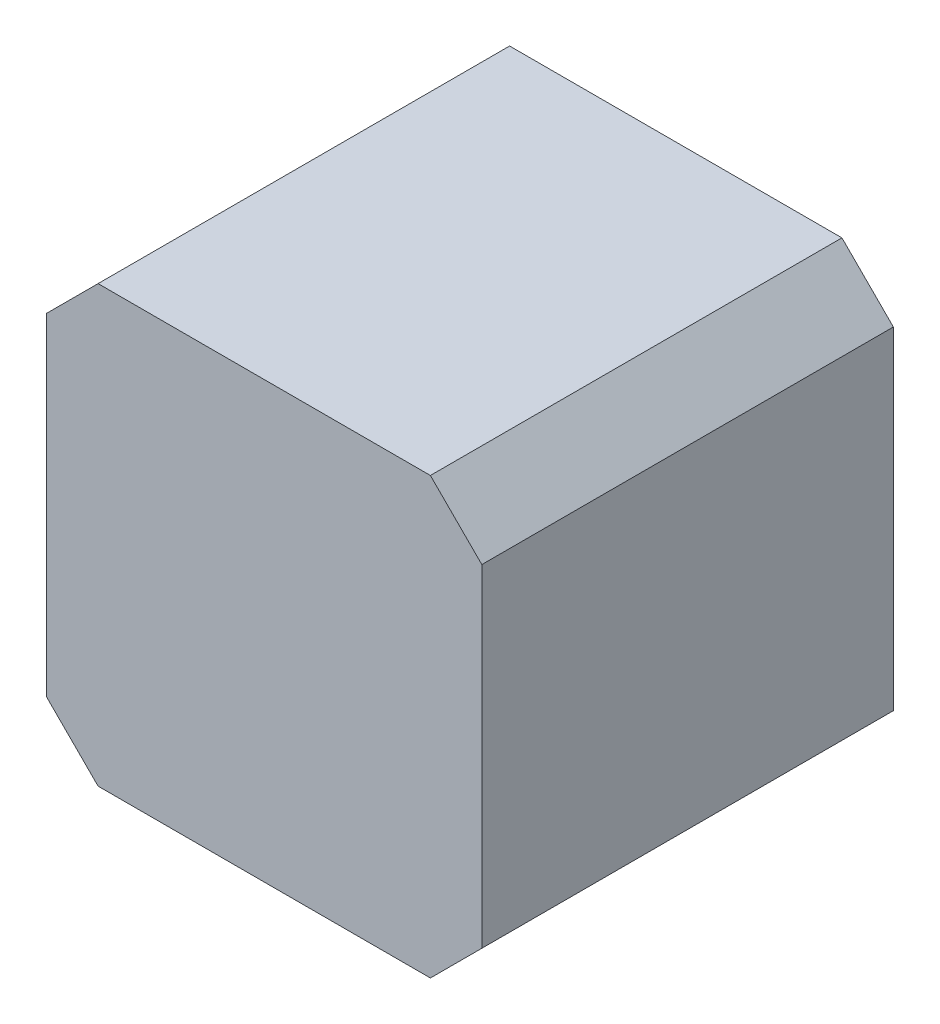
ISO-10303-21;
HEADER;
FILE_DESCRIPTION(('STEP AP214'),'2;1');
FILE_NAME('part.step','',(''),(''),'','','');
FILE_SCHEMA(('AUTOMOTIVE_DESIGN { 1 0 10303 214 1 1 1 1 }'));
ENDSEC;
DATA;
#1=APPLICATION_CONTEXT('core data for automotive mechanical design processes');
#2=APPLICATION_PROTOCOL_DEFINITION('international standard','automotive_design',2000,#1);
#3=PRODUCT_CONTEXT('',#1,'mechanical');
#4=PRODUCT('Part','Part','',(#3));
#5=PRODUCT_RELATED_PRODUCT_CATEGORY('part','',(#4));
#6=PRODUCT_DEFINITION_FORMATION('','',#4);
#7=PRODUCT_DEFINITION_CONTEXT('part definition',#1,'design');
#8=PRODUCT_DEFINITION('design','',#6,#7);
#9=PRODUCT_DEFINITION_SHAPE('','',#8);
#10=(LENGTH_UNIT() NAMED_UNIT(*) SI_UNIT(.MILLI.,.METRE.));
#11=(NAMED_UNIT(*) PLANE_ANGLE_UNIT() SI_UNIT($,.RADIAN.));
#12=(NAMED_UNIT(*) SI_UNIT($,.STERADIAN.) SOLID_ANGLE_UNIT());
#13=UNCERTAINTY_MEASURE_WITH_UNIT(LENGTH_MEASURE(1.E-05),#10,'distance_accuracy_value','');
#14=(GEOMETRIC_REPRESENTATION_CONTEXT(3) GLOBAL_UNCERTAINTY_ASSIGNED_CONTEXT((#13)) GLOBAL_UNIT_ASSIGNED_CONTEXT((#10,
#11,#12)) REPRESENTATION_CONTEXT('',''));
#15=CARTESIAN_POINT('',(0.,0.,0.));
#16=DIRECTION('',(0.,0.,1.));
#17=DIRECTION('',(1.,0.,0.));
#18=AXIS2_PLACEMENT_3D('',#15,#16,#17);
#19=CARTESIAN_POINT('',(-21.15,21.15,40.));
#20=DIRECTION('',(1.,0.,0.));
#21=DIRECTION('',(0.,1.,0.));
#22=AXIS2_PLACEMENT_3D('',#19,#20,#21);
#23=PLANE('',#22);
#24=DIRECTION('',(0.,-1.,0.));
#25=VECTOR('',#24,1.);
#26=CARTESIAN_POINT('',(-21.15,21.15,0.));
#27=LINE('',#26,#25);
#28=CARTESIAN_POINT('',(-21.15,16.15,0.));
#29=VERTEX_POINT('',#28);
#30=CARTESIAN_POINT('',(-21.15,-16.15,0.));
#31=VERTEX_POINT('',#30);
#32=EDGE_CURVE('E125',#29,#31,#27,.T.);
#33=ORIENTED_EDGE('',*,*,#32,.T.);
#34=DIRECTION('',(0.,0.,1.));
#35=VECTOR('',#34,1.);
#36=CARTESIAN_POINT('',(-21.15,-16.15,40.));
#37=LINE('',#36,#35);
#38=CARTESIAN_POINT('',(-21.15,-16.15,40.));
#39=VERTEX_POINT('',#38);
#40=EDGE_CURVE('E103',#31,#39,#37,.T.);
#41=ORIENTED_EDGE('',*,*,#40,.T.);
#42=DIRECTION('',(0.,-1.,0.));
#43=VECTOR('',#42,1.);
#44=CARTESIAN_POINT('',(-21.15,21.15,40.));
#45=LINE('',#44,#43);
#46=CARTESIAN_POINT('',(-21.15,16.15,40.));
#47=VERTEX_POINT('',#46);
#48=EDGE_CURVE('E134',#47,#39,#45,.T.);
#49=ORIENTED_EDGE('',*,*,#48,.F.);
#50=DIRECTION('',(0.,0.,-1.));
#51=VECTOR('',#50,1.);
#52=CARTESIAN_POINT('',(-21.15,16.15,40.));
#53=LINE('',#52,#51);
#54=EDGE_CURVE('E108',#47,#29,#53,.T.);
#55=ORIENTED_EDGE('',*,*,#54,.T.);
#56=EDGE_LOOP('',(#33,#41,#49,#55));
#57=FACE_BOUND('',#56,.T.);
#58=ADVANCED_FACE('F32',(#57),#23,.F.);
#59=CARTESIAN_POINT('',(21.15,-21.15,40.));
#60=DIRECTION('',(0.,1.,0.));
#61=DIRECTION('',(-1.,0.,0.));
#62=AXIS2_PLACEMENT_3D('',#59,#60,#61);
#63=PLANE('',#62);
#64=DIRECTION('',(1.,0.,0.));
#65=VECTOR('',#64,1.);
#66=CARTESIAN_POINT('',(21.15,-21.15,40.));
#67=LINE('',#66,#65);
#68=CARTESIAN_POINT('',(-16.15,-21.15,40.));
#69=VERTEX_POINT('',#68);
#70=CARTESIAN_POINT('',(16.15,-21.15,40.));
#71=VERTEX_POINT('',#70);
#72=EDGE_CURVE('E118',#69,#71,#67,.T.);
#73=ORIENTED_EDGE('',*,*,#72,.F.);
#74=DIRECTION('',(0.,0.,-1.));
#75=VECTOR('',#74,1.);
#76=CARTESIAN_POINT('',(-16.15,-21.15,40.));
#77=LINE('',#76,#75);
#78=CARTESIAN_POINT('',(-16.15,-21.15,0.));
#79=VERTEX_POINT('',#78);
#80=EDGE_CURVE('E102',#69,#79,#77,.T.);
#81=ORIENTED_EDGE('',*,*,#80,.T.);
#82=DIRECTION('',(1.,0.,0.));
#83=VECTOR('',#82,1.);
#84=CARTESIAN_POINT('',(21.15,-21.15,0.));
#85=LINE('',#84,#83);
#86=CARTESIAN_POINT('',(16.15,-21.15,0.));
#87=VERTEX_POINT('',#86);
#88=EDGE_CURVE('E115',#79,#87,#85,.T.);
#89=ORIENTED_EDGE('',*,*,#88,.T.);
#90=DIRECTION('',(0.,0.,1.));
#91=VECTOR('',#90,1.);
#92=CARTESIAN_POINT('',(16.15,-21.15,40.));
#93=LINE('',#92,#91);
#94=EDGE_CURVE('E120',#87,#71,#93,.T.);
#95=ORIENTED_EDGE('',*,*,#94,.T.);
#96=EDGE_LOOP('',(#73,#81,#89,#95));
#97=FACE_BOUND('',#96,.T.);
#98=ADVANCED_FACE('F114',(#97),#63,.F.);
#99=CARTESIAN_POINT('',(21.15,21.15,40.));
#100=DIRECTION('',(-1.,0.,0.));
#101=DIRECTION('',(0.,-1.,0.));
#102=AXIS2_PLACEMENT_3D('',#99,#100,#101);
#103=PLANE('',#102);
#104=DIRECTION('',(0.,1.,0.));
#105=VECTOR('',#104,1.);
#106=CARTESIAN_POINT('',(21.15,21.15,40.));
#107=LINE('',#106,#105);
#108=CARTESIAN_POINT('',(21.15,-16.15,40.));
#109=VERTEX_POINT('',#108);
#110=CARTESIAN_POINT('',(21.15,16.15,40.));
#111=VERTEX_POINT('',#110);
#112=EDGE_CURVE('E160',#109,#111,#107,.T.);
#113=ORIENTED_EDGE('',*,*,#112,.F.);
#114=DIRECTION('',(0.,0.,-1.));
#115=VECTOR('',#114,1.);
#116=CARTESIAN_POINT('',(21.15,-16.15,40.));
#117=LINE('',#116,#115);
#118=CARTESIAN_POINT('',(21.15,-16.15,0.));
#119=VERTEX_POINT('',#118);
#120=EDGE_CURVE('E153',#109,#119,#117,.T.);
#121=ORIENTED_EDGE('',*,*,#120,.T.);
#122=DIRECTION('',(0.,1.,0.));
#123=VECTOR('',#122,1.);
#124=CARTESIAN_POINT('',(21.15,21.15,0.));
#125=LINE('',#124,#123);
#126=CARTESIAN_POINT('',(21.15,16.15,0.));
#127=VERTEX_POINT('',#126);
#128=EDGE_CURVE('E124',#119,#127,#125,.T.);
#129=ORIENTED_EDGE('',*,*,#128,.T.);
#130=DIRECTION('',(0.,0.,1.));
#131=VECTOR('',#130,1.);
#132=CARTESIAN_POINT('',(21.15,16.15,40.));
#133=LINE('',#132,#131);
#134=EDGE_CURVE('E151',#127,#111,#133,.T.);
#135=ORIENTED_EDGE('',*,*,#134,.T.);
#136=EDGE_LOOP('',(#113,#121,#129,#135));
#137=FACE_BOUND('',#136,.T.);
#138=ADVANCED_FACE('F158',(#137),#103,.F.);
#139=CARTESIAN_POINT('',(21.15,21.15,40.));
#140=DIRECTION('',(0.,-1.,0.));
#141=DIRECTION('',(1.,0.,0.));
#142=AXIS2_PLACEMENT_3D('',#139,#140,#141);
#143=PLANE('',#142);
#144=DIRECTION('',(-1.,0.,0.));
#145=VECTOR('',#144,1.);
#146=CARTESIAN_POINT('',(21.15,21.15,40.));
#147=LINE('',#146,#145);
#148=CARTESIAN_POINT('',(16.15,21.15,40.));
#149=VERTEX_POINT('',#148);
#150=CARTESIAN_POINT('',(-16.15,21.15,40.));
#151=VERTEX_POINT('',#150);
#152=EDGE_CURVE('E135',#149,#151,#147,.T.);
#153=ORIENTED_EDGE('',*,*,#152,.F.);
#154=DIRECTION('',(0.,0.,-1.));
#155=VECTOR('',#154,1.);
#156=CARTESIAN_POINT('',(16.15,21.15,40.));
#157=LINE('',#156,#155);
#158=CARTESIAN_POINT('',(16.15,21.15,0.));
#159=VERTEX_POINT('',#158);
#160=EDGE_CURVE('E11',#149,#159,#157,.T.);
#161=ORIENTED_EDGE('',*,*,#160,.T.);
#162=DIRECTION('',(-1.,0.,0.));
#163=VECTOR('',#162,1.);
#164=CARTESIAN_POINT('',(21.15,21.15,0.));
#165=LINE('',#164,#163);
#166=CARTESIAN_POINT('',(-16.15,21.15,0.));
#167=VERTEX_POINT('',#166);
#168=EDGE_CURVE('E128',#159,#167,#165,.T.);
#169=ORIENTED_EDGE('',*,*,#168,.T.);
#170=DIRECTION('',(0.,0.,1.));
#171=VECTOR('',#170,1.);
#172=CARTESIAN_POINT('',(-16.15,21.15,40.));
#173=LINE('',#172,#171);
#174=EDGE_CURVE('E40',#167,#151,#173,.T.);
#175=ORIENTED_EDGE('',*,*,#174,.T.);
#176=EDGE_LOOP('',(#153,#161,#169,#175));
#177=FACE_BOUND('',#176,.T.);
#178=ADVANCED_FACE('F167',(#177),#143,.F.);
#179=CARTESIAN_POINT('',(0.,0.,40.));
#180=DIRECTION('',(0.,0.,-1.));
#181=DIRECTION('',(-1.,0.,0.));
#182=AXIS2_PLACEMENT_3D('',#179,#180,#181);
#183=PLANE('',#182);
#184=ORIENTED_EDGE('',*,*,#48,.T.);
#185=DIRECTION('',(-0.707106781186546,0.707106781186549,0.));
#186=VECTOR('',#185,1.);
#187=CARTESIAN_POINT('',(-16.15,-21.15,40.));
#188=LINE('',#187,#186);
#189=EDGE_CURVE('E149',#39,#69,#188,.F.);
#190=ORIENTED_EDGE('',*,*,#189,.T.);
#191=ORIENTED_EDGE('',*,*,#72,.T.);
#192=DIRECTION('',(-0.707106781186549,-0.707106781186547,0.));
#193=VECTOR('',#192,1.);
#194=CARTESIAN_POINT('',(21.15,-16.15,40.));
#195=LINE('',#194,#193);
#196=EDGE_CURVE('E147',#71,#109,#195,.F.);
#197=ORIENTED_EDGE('',*,*,#196,.T.);
#198=ORIENTED_EDGE('',*,*,#112,.T.);
#199=DIRECTION('',(0.707106781186547,-0.707106781186549,0.));
#200=VECTOR('',#199,1.);
#201=CARTESIAN_POINT('',(16.15,21.15,40.));
#202=LINE('',#201,#200);
#203=EDGE_CURVE('E53',#111,#149,#202,.F.);
#204=ORIENTED_EDGE('',*,*,#203,.T.);
#205=ORIENTED_EDGE('',*,*,#152,.T.);
#206=DIRECTION('',(0.707106781186549,0.707106781186546,0.));
#207=VECTOR('',#206,1.);
#208=CARTESIAN_POINT('',(-21.15,16.15,40.));
#209=LINE('',#208,#207);
#210=EDGE_CURVE('E144',#151,#47,#209,.F.);
#211=ORIENTED_EDGE('',*,*,#210,.T.);
#212=EDGE_LOOP('',(#184,#190,#191,#197,#198,#204,#205,#211));
#213=FACE_BOUND('',#212,.T.);
#214=ADVANCED_FACE('F174',(#213),#183,.F.);
#215=CARTESIAN_POINT('',(0.,0.,0.));
#216=DIRECTION('',(0.,0.,-1.));
#217=DIRECTION('',(-1.,0.,0.));
#218=AXIS2_PLACEMENT_3D('',#215,#216,#217);
#219=PLANE('',#218);
#220=ORIENTED_EDGE('',*,*,#88,.F.);
#221=DIRECTION('',(0.707106781186546,-0.707106781186549,0.));
#222=VECTOR('',#221,1.);
#223=CARTESIAN_POINT('',(-18.65,-18.65,0.));
#224=LINE('',#223,#222);
#225=EDGE_CURVE('E98',#79,#31,#224,.F.);
#226=ORIENTED_EDGE('',*,*,#225,.T.);
#227=ORIENTED_EDGE('',*,*,#32,.F.);
#228=DIRECTION('',(-0.707106781186549,-0.707106781186546,0.));
#229=VECTOR('',#228,1.);
#230=CARTESIAN_POINT('',(-18.65,18.65,0.));
#231=LINE('',#230,#229);
#232=EDGE_CURVE('E119',#29,#167,#231,.F.);
#233=ORIENTED_EDGE('',*,*,#232,.T.);
#234=ORIENTED_EDGE('',*,*,#168,.F.);
#235=DIRECTION('',(-0.707106781186547,0.707106781186549,0.));
#236=VECTOR('',#235,1.);
#237=CARTESIAN_POINT('',(18.65,18.65,0.));
#238=LINE('',#237,#236);
#239=EDGE_CURVE('E138',#159,#127,#238,.F.);
#240=ORIENTED_EDGE('',*,*,#239,.T.);
#241=ORIENTED_EDGE('',*,*,#128,.F.);
#242=DIRECTION('',(0.707106781186549,0.707106781186547,0.));
#243=VECTOR('',#242,1.);
#244=CARTESIAN_POINT('',(18.65,-18.65,0.));
#245=LINE('',#244,#243);
#246=EDGE_CURVE('E109',#119,#87,#245,.F.);
#247=ORIENTED_EDGE('',*,*,#246,.T.);
#248=EDGE_LOOP('',(#220,#226,#227,#233,#234,#240,#241,#247));
#249=FACE_BOUND('',#248,.T.);
#250=ADVANCED_FACE('F122',(#249),#219,.T.);
#251=CARTESIAN_POINT('',(-16.15,-21.15,40.));
#252=DIRECTION('',(0.707106781186549,0.707106781186546,0.));
#253=DIRECTION('',(0.,0.,-1.));
#254=AXIS2_PLACEMENT_3D('',#251,#252,#253);
#255=PLANE('',#254);
#256=ORIENTED_EDGE('',*,*,#189,.F.);
#257=ORIENTED_EDGE('',*,*,#40,.F.);
#258=ORIENTED_EDGE('',*,*,#225,.F.);
#259=ORIENTED_EDGE('',*,*,#80,.F.);
#260=EDGE_LOOP('',(#256,#257,#258,#259));
#261=FACE_BOUND('',#260,.T.);
#262=ADVANCED_FACE('F101',(#261),#255,.F.);
#263=CARTESIAN_POINT('',(21.15,-16.15,40.));
#264=DIRECTION('',(-0.707106781186547,0.707106781186549,0.));
#265=DIRECTION('',(0.,0.,-1.));
#266=AXIS2_PLACEMENT_3D('',#263,#264,#265);
#267=PLANE('',#266);
#268=ORIENTED_EDGE('',*,*,#196,.F.);
#269=ORIENTED_EDGE('',*,*,#94,.F.);
#270=ORIENTED_EDGE('',*,*,#246,.F.);
#271=ORIENTED_EDGE('',*,*,#120,.F.);
#272=EDGE_LOOP('',(#268,#269,#270,#271));
#273=FACE_BOUND('',#272,.T.);
#274=ADVANCED_FACE('F182',(#273),#267,.F.);
#275=CARTESIAN_POINT('',(16.15,21.15,40.));
#276=DIRECTION('',(-0.707106781186549,-0.707106781186547,0.));
#277=DIRECTION('',(0.,0.,-1.));
#278=AXIS2_PLACEMENT_3D('',#275,#276,#277);
#279=PLANE('',#278);
#280=ORIENTED_EDGE('',*,*,#203,.F.);
#281=ORIENTED_EDGE('',*,*,#134,.F.);
#282=ORIENTED_EDGE('',*,*,#239,.F.);
#283=ORIENTED_EDGE('',*,*,#160,.F.);
#284=EDGE_LOOP('',(#280,#281,#282,#283));
#285=FACE_BOUND('',#284,.T.);
#286=ADVANCED_FACE('F166',(#285),#279,.F.);
#287=CARTESIAN_POINT('',(-21.15,16.15,40.));
#288=DIRECTION('',(0.707106781186546,-0.707106781186549,0.));
#289=DIRECTION('',(0.,0.,-1.));
#290=AXIS2_PLACEMENT_3D('',#287,#288,#289);
#291=PLANE('',#290);
#292=ORIENTED_EDGE('',*,*,#210,.F.);
#293=ORIENTED_EDGE('',*,*,#174,.F.);
#294=ORIENTED_EDGE('',*,*,#232,.F.);
#295=ORIENTED_EDGE('',*,*,#54,.F.);
#296=EDGE_LOOP('',(#292,#293,#294,#295));
#297=FACE_BOUND('',#296,.T.);
#298=ADVANCED_FACE('F34',(#297),#291,.F.);
#299=CLOSED_SHELL('',(#58,#98,#138,#178,#214,#250,#262,#274,#286,#298));
#300=MANIFOLD_SOLID_BREP('B2',#299);
#301=ADVANCED_BREP_SHAPE_REPRESENTATION('',(#18,#300),#14);
#302=SHAPE_DEFINITION_REPRESENTATION(#9,#301);
ENDSEC;
END-ISO-10303-21;
